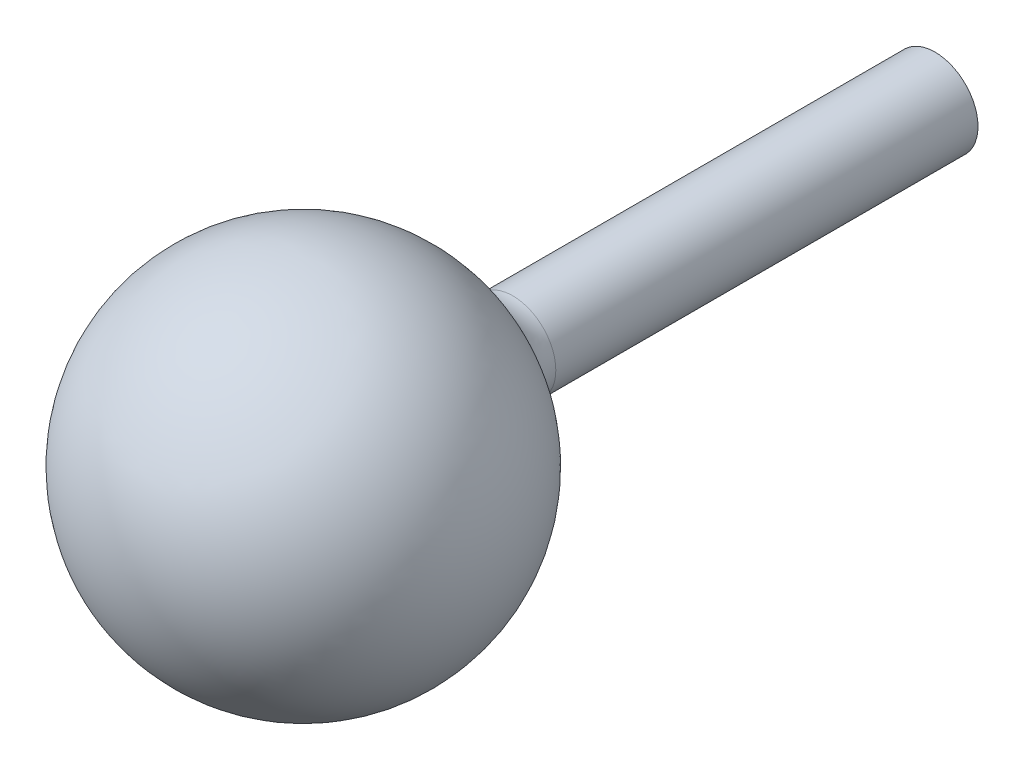
ISO-10303-21;
HEADER;
FILE_DESCRIPTION(('STEP AP214'),'2;1');
FILE_NAME('part.step','',(''),(''),'','','');
FILE_SCHEMA(('AUTOMOTIVE_DESIGN { 1 0 10303 214 1 1 1 1 }'));
ENDSEC;
DATA;
#1=APPLICATION_CONTEXT('core data for automotive mechanical design processes');
#2=APPLICATION_PROTOCOL_DEFINITION('international standard','automotive_design',2000,#1);
#3=PRODUCT_CONTEXT('',#1,'mechanical');
#4=PRODUCT('Part','Part','',(#3));
#5=PRODUCT_RELATED_PRODUCT_CATEGORY('part','',(#4));
#6=PRODUCT_DEFINITION_FORMATION('','',#4);
#7=PRODUCT_DEFINITION_CONTEXT('part definition',#1,'design');
#8=PRODUCT_DEFINITION('design','',#6,#7);
#9=PRODUCT_DEFINITION_SHAPE('','',#8);
#10=(LENGTH_UNIT() NAMED_UNIT(*) SI_UNIT(.MILLI.,.METRE.));
#11=(NAMED_UNIT(*) PLANE_ANGLE_UNIT() SI_UNIT($,.RADIAN.));
#12=(NAMED_UNIT(*) SI_UNIT($,.STERADIAN.) SOLID_ANGLE_UNIT());
#13=UNCERTAINTY_MEASURE_WITH_UNIT(LENGTH_MEASURE(1.E-05),#10,'distance_accuracy_value','');
#14=(GEOMETRIC_REPRESENTATION_CONTEXT(3) GLOBAL_UNCERTAINTY_ASSIGNED_CONTEXT((#13)) GLOBAL_UNIT_ASSIGNED_CONTEXT((#10,
#11,#12)) REPRESENTATION_CONTEXT('',''));
#15=CARTESIAN_POINT('',(0.,0.,0.));
#16=DIRECTION('',(0.,0.,1.));
#17=DIRECTION('',(1.,0.,0.));
#18=AXIS2_PLACEMENT_3D('',#15,#16,#17);
#19=CARTESIAN_POINT('',(0.,0.,63.5));
#20=DIRECTION('',(0.,0.,-1.));
#21=DIRECTION('',(-1.,0.,0.));
#22=AXIS2_PLACEMENT_3D('',#19,#20,#21);
#23=CYLINDRICAL_SURFACE('',#22,6.);
#24=CARTESIAN_POINT('',(0.,0.,58.9315515271176));
#25=DIRECTION('',(0.,0.,1.));
#26=DIRECTION('',(1.,0.,0.));
#27=AXIS2_PLACEMENT_3D('',#24,#25,#26);
#28=CIRCLE('',#27,6.);
#29=CARTESIAN_POINT('',(6.,0.,58.9315515271176));
#30=VERTEX_POINT('',#29);
#31=EDGE_CURVE('E11',#30,#30,#28,.F.);
#32=ORIENTED_EDGE('',*,*,#31,.T.);
#33=EDGE_LOOP('',(#32));
#34=FACE_BOUND('',#33,.T.);
#35=CARTESIAN_POINT('',(0.,0.,0.));
#36=DIRECTION('',(0.,0.,1.));
#37=DIRECTION('',(1.,0.,0.));
#38=AXIS2_PLACEMENT_3D('',#35,#36,#37);
#39=CIRCLE('',#38,6.);
#40=CARTESIAN_POINT('',(6.,0.,0.));
#41=VERTEX_POINT('',#40);
#42=EDGE_CURVE('E115',#41,#41,#39,.T.);
#43=ORIENTED_EDGE('',*,*,#42,.T.);
#44=EDGE_LOOP('',(#43));
#45=FACE_BOUND('',#44,.T.);
#46=ADVANCED_FACE('F39',(#34,#45),#23,.T.);
#47=CARTESIAN_POINT('',(0.,0.,0.));
#48=DIRECTION('',(0.,0.,1.));
#49=DIRECTION('',(1.,0.,0.));
#50=AXIS2_PLACEMENT_3D('',#47,#48,#49);
#51=PLANE('',#50);
#52=DIRECTION('',(-1.,0.,0.));
#53=VECTOR('',#52,1.);
#54=CARTESIAN_POINT('',(0.7,-1.1,0.));
#55=LINE('',#54,#53);
#56=CARTESIAN_POINT('',(0.7,-1.1,0.));
#57=VERTEX_POINT('',#56);
#58=CARTESIAN_POINT('',(-0.7,-1.1,0.));
#59=VERTEX_POINT('',#58);
#60=EDGE_CURVE('E89',#57,#59,#55,.T.);
#61=ORIENTED_EDGE('',*,*,#60,.F.);
#62=DIRECTION('',(0.,-1.,0.));
#63=VECTOR('',#62,1.);
#64=CARTESIAN_POINT('',(0.7,1.1,0.));
#65=LINE('',#64,#63);
#66=CARTESIAN_POINT('',(0.7,1.1,0.));
#67=VERTEX_POINT('',#66);
#68=EDGE_CURVE('E54',#67,#57,#65,.T.);
#69=ORIENTED_EDGE('',*,*,#68,.F.);
#70=DIRECTION('',(1.,0.,0.));
#71=VECTOR('',#70,1.);
#72=CARTESIAN_POINT('',(0.7,1.1,0.));
#73=LINE('',#72,#71);
#74=CARTESIAN_POINT('',(-0.7,1.1,0.));
#75=VERTEX_POINT('',#74);
#76=EDGE_CURVE('E105',#75,#67,#73,.T.);
#77=ORIENTED_EDGE('',*,*,#76,.F.);
#78=DIRECTION('',(0.,1.,0.));
#79=VECTOR('',#78,1.);
#80=CARTESIAN_POINT('',(-0.7,1.1,0.));
#81=LINE('',#80,#79);
#82=EDGE_CURVE('E111',#59,#75,#81,.T.);
#83=ORIENTED_EDGE('',*,*,#82,.F.);
#84=EDGE_LOOP('',(#61,#69,#77,#83));
#85=FACE_BOUND('',#84,.T.);
#86=ORIENTED_EDGE('',*,*,#42,.F.);
#87=EDGE_LOOP('',(#86));
#88=FACE_BOUND('',#87,.T.);
#89=ADVANCED_FACE('F133',(#85,#88),#51,.F.);
#90=CARTESIAN_POINT('',(0.,0.,88.1811669092043));
#91=DIRECTION('',(0.,0.,-1.));
#92=DIRECTION('',(0.,1.,0.));
#93=AXIS2_PLACEMENT_3D('',#90,#91,#92);
#94=SPHERICAL_SURFACE('',#93,25.4);
#95=CARTESIAN_POINT('',(0.,0.,64.7814746035349));
#96=DIRECTION('',(0.,0.,1.));
#97=DIRECTION('',(1.,0.,0.));
#98=AXIS2_PLACEMENT_3D('',#95,#96,#97);
#99=CIRCLE('',#98,9.88);
#100=CARTESIAN_POINT('',(9.88,0.,64.7814746035349));
#101=VERTEX_POINT('',#100);
#102=EDGE_CURVE('E47',#101,#101,#99,.T.);
#103=ORIENTED_EDGE('',*,*,#102,.T.);
#104=EDGE_LOOP('',(#103));
#105=FACE_BOUND('',#104,.T.);
#106=ADVANCED_FACE('F122',(#105),#94,.T.);
#107=CARTESIAN_POINT('',(0.7,1.1,50.8));
#108=DIRECTION('',(1.,0.,0.));
#109=DIRECTION('',(0.,0.,-1.));
#110=AXIS2_PLACEMENT_3D('',#107,#108,#109);
#111=PLANE('',#110);
#112=ORIENTED_EDGE('',*,*,#68,.T.);
#113=DIRECTION('',(0.,0.,-1.));
#114=VECTOR('',#113,1.);
#115=CARTESIAN_POINT('',(0.7,-1.1,50.8));
#116=LINE('',#115,#114);
#117=CARTESIAN_POINT('',(0.7,-1.1,50.8));
#118=VERTEX_POINT('',#117);
#119=EDGE_CURVE('E77',#118,#57,#116,.T.);
#120=ORIENTED_EDGE('',*,*,#119,.F.);
#121=DIRECTION('',(0.,-1.,0.));
#122=VECTOR('',#121,1.);
#123=CARTESIAN_POINT('',(0.7,1.1,50.8));
#124=LINE('',#123,#122);
#125=CARTESIAN_POINT('',(0.7,1.1,50.8));
#126=VERTEX_POINT('',#125);
#127=EDGE_CURVE('E103',#126,#118,#124,.T.);
#128=ORIENTED_EDGE('',*,*,#127,.F.);
#129=DIRECTION('',(0.,0.,-1.));
#130=VECTOR('',#129,1.);
#131=CARTESIAN_POINT('',(0.7,1.1,50.8));
#132=LINE('',#131,#130);
#133=EDGE_CURVE('E62',#126,#67,#132,.T.);
#134=ORIENTED_EDGE('',*,*,#133,.T.);
#135=EDGE_LOOP('',(#112,#120,#128,#134));
#136=FACE_BOUND('',#135,.T.);
#137=ADVANCED_FACE('F143',(#136),#111,.F.);
#138=CARTESIAN_POINT('',(0.7,1.1,50.8));
#139=DIRECTION('',(0.,1.,0.));
#140=DIRECTION('',(0.,0.,1.));
#141=AXIS2_PLACEMENT_3D('',#138,#139,#140);
#142=PLANE('',#141);
#143=ORIENTED_EDGE('',*,*,#76,.T.);
#144=ORIENTED_EDGE('',*,*,#133,.F.);
#145=DIRECTION('',(1.,0.,0.));
#146=VECTOR('',#145,1.);
#147=CARTESIAN_POINT('',(0.7,1.1,50.8));
#148=LINE('',#147,#146);
#149=CARTESIAN_POINT('',(-0.7,1.1,50.8));
#150=VERTEX_POINT('',#149);
#151=EDGE_CURVE('E100',#150,#126,#148,.T.);
#152=ORIENTED_EDGE('',*,*,#151,.F.);
#153=DIRECTION('',(0.,0.,-1.));
#154=VECTOR('',#153,1.);
#155=CARTESIAN_POINT('',(-0.7,1.1,50.8));
#156=LINE('',#155,#154);
#157=EDGE_CURVE('E93',#150,#75,#156,.T.);
#158=ORIENTED_EDGE('',*,*,#157,.T.);
#159=EDGE_LOOP('',(#143,#144,#152,#158));
#160=FACE_BOUND('',#159,.T.);
#161=ADVANCED_FACE('F146',(#160),#142,.F.);
#162=CARTESIAN_POINT('',(-0.7,1.1,50.8));
#163=DIRECTION('',(-1.,0.,0.));
#164=DIRECTION('',(0.,-1.,0.));
#165=AXIS2_PLACEMENT_3D('',#162,#163,#164);
#166=PLANE('',#165);
#167=ORIENTED_EDGE('',*,*,#82,.T.);
#168=ORIENTED_EDGE('',*,*,#157,.F.);
#169=DIRECTION('',(0.,1.,0.));
#170=VECTOR('',#169,1.);
#171=CARTESIAN_POINT('',(-0.7,1.1,50.8));
#172=LINE('',#171,#170);
#173=CARTESIAN_POINT('',(-0.7,-1.1,50.8));
#174=VERTEX_POINT('',#173);
#175=EDGE_CURVE('E96',#174,#150,#172,.T.);
#176=ORIENTED_EDGE('',*,*,#175,.F.);
#177=DIRECTION('',(0.,0.,-1.));
#178=VECTOR('',#177,1.);
#179=CARTESIAN_POINT('',(-0.7,-1.1,50.8));
#180=LINE('',#179,#178);
#181=EDGE_CURVE('E82',#174,#59,#180,.T.);
#182=ORIENTED_EDGE('',*,*,#181,.T.);
#183=EDGE_LOOP('',(#167,#168,#176,#182));
#184=FACE_BOUND('',#183,.T.);
#185=ADVANCED_FACE('F97',(#184),#166,.F.);
#186=CARTESIAN_POINT('',(0.7,-1.1,50.8));
#187=DIRECTION('',(0.,-1.,0.));
#188=DIRECTION('',(0.,0.,-1.));
#189=AXIS2_PLACEMENT_3D('',#186,#187,#188);
#190=PLANE('',#189);
#191=ORIENTED_EDGE('',*,*,#60,.T.);
#192=ORIENTED_EDGE('',*,*,#181,.F.);
#193=DIRECTION('',(-1.,0.,0.));
#194=VECTOR('',#193,1.);
#195=CARTESIAN_POINT('',(0.7,-1.1,50.8));
#196=LINE('',#195,#194);
#197=EDGE_CURVE('E86',#118,#174,#196,.T.);
#198=ORIENTED_EDGE('',*,*,#197,.F.);
#199=ORIENTED_EDGE('',*,*,#119,.T.);
#200=EDGE_LOOP('',(#191,#192,#198,#199));
#201=FACE_BOUND('',#200,.T.);
#202=ADVANCED_FACE('F84',(#201),#190,.F.);
#203=CARTESIAN_POINT('',(0.,0.,50.8));
#204=DIRECTION('',(0.,0.,-1.));
#205=DIRECTION('',(-1.,0.,0.));
#206=AXIS2_PLACEMENT_3D('',#203,#204,#205);
#207=PLANE('',#206);
#208=ORIENTED_EDGE('',*,*,#127,.T.);
#209=ORIENTED_EDGE('',*,*,#197,.T.);
#210=ORIENTED_EDGE('',*,*,#175,.T.);
#211=ORIENTED_EDGE('',*,*,#151,.T.);
#212=EDGE_LOOP('',(#208,#209,#210,#211));
#213=FACE_BOUND('',#212,.T.);
#214=ADVANCED_FACE('F102',(#213),#207,.T.);
#215=CARTESIAN_POINT('',(0.,0.,58.9315515271176));
#216=DIRECTION('',(0.,0.,1.));
#217=DIRECTION('',(1.,0.,0.));
#218=AXIS2_PLACEMENT_3D('',#215,#216,#217);
#219=TOROIDAL_SURFACE('',#218,12.35,6.35);
#220=ORIENTED_EDGE('',*,*,#31,.F.);
#221=EDGE_LOOP('',(#220));
#222=FACE_BOUND('',#221,.T.);
#223=ORIENTED_EDGE('',*,*,#102,.F.);
#224=EDGE_LOOP('',(#223));
#225=FACE_BOUND('',#224,.T.);
#226=ADVANCED_FACE('F41',(#222,#225),#219,.F.);
#227=CLOSED_SHELL('',(#46,#89,#106,#137,#161,#185,#202,#214,#226));
#228=MANIFOLD_SOLID_BREP('B2',#227);
#229=ADVANCED_BREP_SHAPE_REPRESENTATION('',(#18,#228),#14);
#230=SHAPE_DEFINITION_REPRESENTATION(#9,#229);
ENDSEC;
END-ISO-10303-21;
